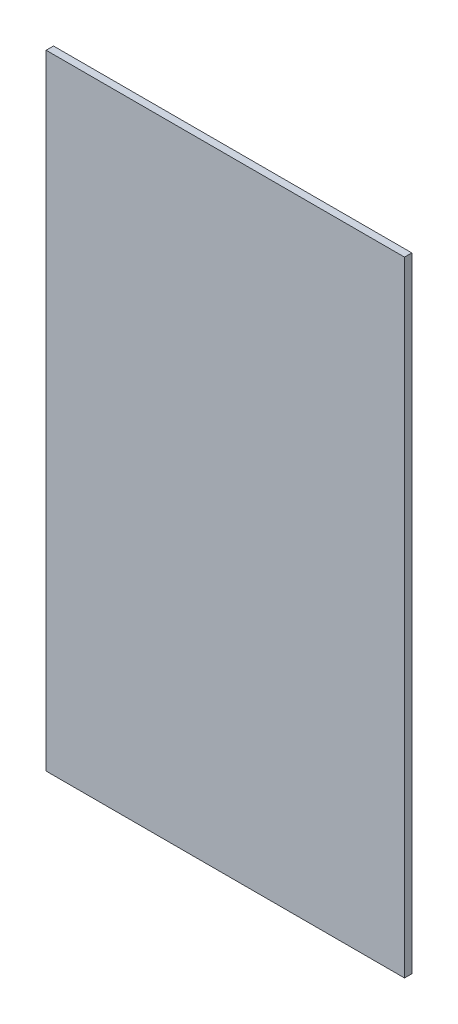
ISO-10303-21;
HEADER;
FILE_DESCRIPTION(('STEP AP214'),'2;1');
FILE_NAME('part.step','',(''),(''),'','','');
FILE_SCHEMA(('AUTOMOTIVE_DESIGN { 1 0 10303 214 1 1 1 1 }'));
ENDSEC;
DATA;
#1=APPLICATION_CONTEXT('core data for automotive mechanical design processes');
#2=APPLICATION_PROTOCOL_DEFINITION('international standard','automotive_design',2000,#1);
#3=PRODUCT_CONTEXT('',#1,'mechanical');
#4=PRODUCT('Part','Part','',(#3));
#5=PRODUCT_RELATED_PRODUCT_CATEGORY('part','',(#4));
#6=PRODUCT_DEFINITION_FORMATION('','',#4);
#7=PRODUCT_DEFINITION_CONTEXT('part definition',#1,'design');
#8=PRODUCT_DEFINITION('design','',#6,#7);
#9=PRODUCT_DEFINITION_SHAPE('','',#8);
#10=(LENGTH_UNIT() NAMED_UNIT(*) SI_UNIT(.MILLI.,.METRE.));
#11=(NAMED_UNIT(*) PLANE_ANGLE_UNIT() SI_UNIT($,.RADIAN.));
#12=(NAMED_UNIT(*) SI_UNIT($,.STERADIAN.) SOLID_ANGLE_UNIT());
#13=UNCERTAINTY_MEASURE_WITH_UNIT(LENGTH_MEASURE(1.E-05),#10,'distance_accuracy_value','');
#14=(GEOMETRIC_REPRESENTATION_CONTEXT(3) GLOBAL_UNCERTAINTY_ASSIGNED_CONTEXT((#13)) GLOBAL_UNIT_ASSIGNED_CONTEXT((#10,
#11,#12)) REPRESENTATION_CONTEXT('',''));
#15=CARTESIAN_POINT('',(0.,0.,0.));
#16=DIRECTION('',(0.,0.,1.));
#17=DIRECTION('',(1.,0.,0.));
#18=AXIS2_PLACEMENT_3D('',#15,#16,#17);
#19=CARTESIAN_POINT('',(10.,0.,-2.));
#20=DIRECTION('',(-1.,0.,0.));
#21=DIRECTION('',(0.,0.,1.));
#22=AXIS2_PLACEMENT_3D('',#19,#20,#21);
#23=PLANE('',#22);
#24=DIRECTION('',(0.,-1.,0.));
#25=VECTOR('',#24,1.);
#26=CARTESIAN_POINT('',(10.,0.,0.));
#27=LINE('',#26,#25);
#28=CARTESIAN_POINT('',(10.,169.999999999977,0.));
#29=VERTEX_POINT('',#28);
#30=CARTESIAN_POINT('',(10.,0.,0.));
#31=VERTEX_POINT('',#30);
#32=EDGE_CURVE('E102',#29,#31,#27,.T.);
#33=ORIENTED_EDGE('',*,*,#32,.F.);
#34=DIRECTION('',(0.,0.,1.));
#35=VECTOR('',#34,1.);
#36=CARTESIAN_POINT('',(10.,169.999999999977,-2.));
#37=LINE('',#36,#35);
#38=CARTESIAN_POINT('',(10.,169.999999999977,-2.));
#39=VERTEX_POINT('',#38);
#40=EDGE_CURVE('E11',#39,#29,#37,.T.);
#41=ORIENTED_EDGE('',*,*,#40,.F.);
#42=DIRECTION('',(0.,-1.,0.));
#43=VECTOR('',#42,1.);
#44=CARTESIAN_POINT('',(10.,0.,-2.));
#45=LINE('',#44,#43);
#46=CARTESIAN_POINT('',(10.,0.,-2.));
#47=VERTEX_POINT('',#46);
#48=EDGE_CURVE('E96',#39,#47,#45,.T.);
#49=ORIENTED_EDGE('',*,*,#48,.T.);
#50=DIRECTION('',(0.,0.,1.));
#51=VECTOR('',#50,1.);
#52=CARTESIAN_POINT('',(10.,0.,-2.));
#53=LINE('',#52,#51);
#54=EDGE_CURVE('E41',#47,#31,#53,.T.);
#55=ORIENTED_EDGE('',*,*,#54,.T.);
#56=EDGE_LOOP('',(#33,#41,#49,#55));
#57=FACE_BOUND('',#56,.T.);
#58=ADVANCED_FACE('F38',(#57),#23,.T.);
#59=CARTESIAN_POINT('',(10.,169.999999999977,-2.));
#60=DIRECTION('',(0.,1.,0.));
#61=DIRECTION('',(0.,0.,1.));
#62=AXIS2_PLACEMENT_3D('',#59,#60,#61);
#63=PLANE('',#62);
#64=DIRECTION('',(-1.,0.,0.));
#65=VECTOR('',#64,1.);
#66=CARTESIAN_POINT('',(10.,169.999999999977,0.));
#67=LINE('',#66,#65);
#68=CARTESIAN_POINT('',(107.574458650228,169.999999999977,0.));
#69=VERTEX_POINT('',#68);
#70=EDGE_CURVE('E98',#69,#29,#67,.T.);
#71=ORIENTED_EDGE('',*,*,#70,.F.);
#72=DIRECTION('',(0.,0.,1.));
#73=VECTOR('',#72,1.);
#74=CARTESIAN_POINT('',(107.574458650228,169.999999999977,-2.));
#75=LINE('',#74,#73);
#76=CARTESIAN_POINT('',(107.574458650228,169.999999999977,-2.));
#77=VERTEX_POINT('',#76);
#78=EDGE_CURVE('E47',#77,#69,#75,.T.);
#79=ORIENTED_EDGE('',*,*,#78,.F.);
#80=DIRECTION('',(-1.,0.,0.));
#81=VECTOR('',#80,1.);
#82=CARTESIAN_POINT('',(10.,169.999999999977,-2.));
#83=LINE('',#82,#81);
#84=EDGE_CURVE('E93',#77,#39,#83,.T.);
#85=ORIENTED_EDGE('',*,*,#84,.T.);
#86=ORIENTED_EDGE('',*,*,#40,.T.);
#87=EDGE_LOOP('',(#71,#79,#85,#86));
#88=FACE_BOUND('',#87,.T.);
#89=ADVANCED_FACE('F112',(#88),#63,.T.);
#90=CARTESIAN_POINT('',(107.574458650228,0.,-2.));
#91=DIRECTION('',(1.,0.,0.));
#92=DIRECTION('',(0.,1.,0.));
#93=AXIS2_PLACEMENT_3D('',#90,#91,#92);
#94=PLANE('',#93);
#95=DIRECTION('',(0.,1.,0.));
#96=VECTOR('',#95,1.);
#97=CARTESIAN_POINT('',(107.574458650228,0.,0.));
#98=LINE('',#97,#96);
#99=CARTESIAN_POINT('',(107.574458650228,0.,0.));
#100=VERTEX_POINT('',#99);
#101=EDGE_CURVE('E88',#100,#69,#98,.T.);
#102=ORIENTED_EDGE('',*,*,#101,.F.);
#103=DIRECTION('',(0.,0.,1.));
#104=VECTOR('',#103,1.);
#105=CARTESIAN_POINT('',(107.574458650228,0.,-2.));
#106=LINE('',#105,#104);
#107=CARTESIAN_POINT('',(107.574458650228,0.,-2.));
#108=VERTEX_POINT('',#107);
#109=EDGE_CURVE('E83',#108,#100,#106,.T.);
#110=ORIENTED_EDGE('',*,*,#109,.F.);
#111=DIRECTION('',(0.,1.,0.));
#112=VECTOR('',#111,1.);
#113=CARTESIAN_POINT('',(107.574458650228,0.,-2.));
#114=LINE('',#113,#112);
#115=EDGE_CURVE('E86',#108,#77,#114,.T.);
#116=ORIENTED_EDGE('',*,*,#115,.T.);
#117=ORIENTED_EDGE('',*,*,#78,.T.);
#118=EDGE_LOOP('',(#102,#110,#116,#117));
#119=FACE_BOUND('',#118,.T.);
#120=ADVANCED_FACE('F85',(#119),#94,.T.);
#121=CARTESIAN_POINT('',(10.,0.,-2.));
#122=DIRECTION('',(0.,-1.,0.));
#123=DIRECTION('',(0.,0.,-1.));
#124=AXIS2_PLACEMENT_3D('',#121,#122,#123);
#125=PLANE('',#124);
#126=DIRECTION('',(1.,0.,0.));
#127=VECTOR('',#126,1.);
#128=CARTESIAN_POINT('',(10.,0.,0.));
#129=LINE('',#128,#127);
#130=EDGE_CURVE('E105',#31,#100,#129,.T.);
#131=ORIENTED_EDGE('',*,*,#130,.F.);
#132=ORIENTED_EDGE('',*,*,#54,.F.);
#133=DIRECTION('',(1.,0.,0.));
#134=VECTOR('',#133,1.);
#135=CARTESIAN_POINT('',(10.,0.,-2.));
#136=LINE('',#135,#134);
#137=EDGE_CURVE('E92',#47,#108,#136,.T.);
#138=ORIENTED_EDGE('',*,*,#137,.T.);
#139=ORIENTED_EDGE('',*,*,#109,.T.);
#140=EDGE_LOOP('',(#131,#132,#138,#139));
#141=FACE_BOUND('',#140,.T.);
#142=ADVANCED_FACE('F95',(#141),#125,.T.);
#143=CARTESIAN_POINT('',(0.,0.,-2.));
#144=DIRECTION('',(0.,0.,-1.));
#145=DIRECTION('',(-1.,0.,0.));
#146=AXIS2_PLACEMENT_3D('',#143,#144,#145);
#147=PLANE('',#146);
#148=ORIENTED_EDGE('',*,*,#48,.F.);
#149=ORIENTED_EDGE('',*,*,#84,.F.);
#150=ORIENTED_EDGE('',*,*,#115,.F.);
#151=ORIENTED_EDGE('',*,*,#137,.F.);
#152=EDGE_LOOP('',(#148,#149,#150,#151));
#153=FACE_BOUND('',#152,.T.);
#154=ADVANCED_FACE('F91',(#153),#147,.T.);
#155=CARTESIAN_POINT('',(0.,0.,0.));
#156=DIRECTION('',(0.,0.,-1.));
#157=DIRECTION('',(-1.,0.,0.));
#158=AXIS2_PLACEMENT_3D('',#155,#156,#157);
#159=PLANE('',#158);
#160=ORIENTED_EDGE('',*,*,#32,.T.);
#161=ORIENTED_EDGE('',*,*,#130,.T.);
#162=ORIENTED_EDGE('',*,*,#101,.T.);
#163=ORIENTED_EDGE('',*,*,#70,.T.);
#164=EDGE_LOOP('',(#160,#161,#162,#163));
#165=FACE_BOUND('',#164,.T.);
#166=ADVANCED_FACE('F111',(#165),#159,.F.);
#167=CLOSED_SHELL('',(#58,#89,#120,#142,#154,#166));
#168=MANIFOLD_SOLID_BREP('B2',#167);
#169=ADVANCED_BREP_SHAPE_REPRESENTATION('',(#18,#168),#14);
#170=SHAPE_DEFINITION_REPRESENTATION(#9,#169);
ENDSEC;
END-ISO-10303-21;
